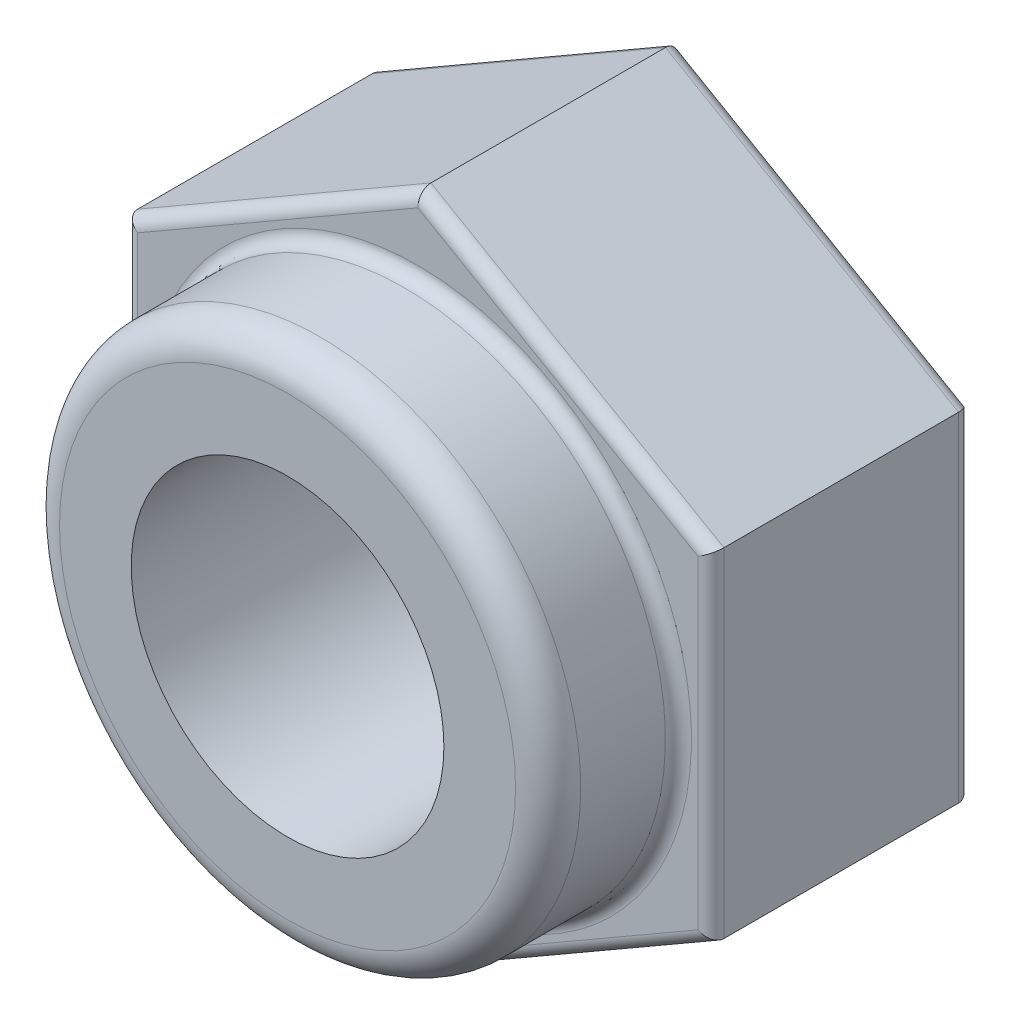
ISO-10303-21;
HEADER;
FILE_DESCRIPTION(('STEP AP214'),'2;1');
FILE_NAME('part.step','',(''),(''),'','','');
FILE_SCHEMA(('AUTOMOTIVE_DESIGN { 1 0 10303 214 1 1 1 1 }'));
ENDSEC;
DATA;
#1=APPLICATION_CONTEXT('core data for automotive mechanical design processes');
#2=APPLICATION_PROTOCOL_DEFINITION('international standard','automotive_design',2000,#1);
#3=PRODUCT_CONTEXT('',#1,'mechanical');
#4=PRODUCT('Part','Part','',(#3));
#5=PRODUCT_RELATED_PRODUCT_CATEGORY('part','',(#4));
#6=PRODUCT_DEFINITION_FORMATION('','',#4);
#7=PRODUCT_DEFINITION_CONTEXT('part definition',#1,'design');
#8=PRODUCT_DEFINITION('design','',#6,#7);
#9=PRODUCT_DEFINITION_SHAPE('','',#8);
#10=(LENGTH_UNIT() NAMED_UNIT(*) SI_UNIT(.MILLI.,.METRE.));
#11=(NAMED_UNIT(*) PLANE_ANGLE_UNIT() SI_UNIT($,.RADIAN.));
#12=(NAMED_UNIT(*) SI_UNIT($,.STERADIAN.) SOLID_ANGLE_UNIT());
#13=UNCERTAINTY_MEASURE_WITH_UNIT(LENGTH_MEASURE(1.E-05),#10,'distance_accuracy_value','');
#14=(GEOMETRIC_REPRESENTATION_CONTEXT(3) GLOBAL_UNCERTAINTY_ASSIGNED_CONTEXT((#13)) GLOBAL_UNIT_ASSIGNED_CONTEXT((#10,
#11,#12)) REPRESENTATION_CONTEXT('',''));
#15=CARTESIAN_POINT('',(0.,0.,0.));
#16=DIRECTION('',(0.,0.,1.));
#17=DIRECTION('',(1.,0.,0.));
#18=AXIS2_PLACEMENT_3D('',#15,#16,#17);
#19=CARTESIAN_POINT('',(-5.715,3.29955678841871,5.08));
#20=DIRECTION('',(0.5,-0.866025403784439,0.));
#21=DIRECTION('',(0.866025403784439,0.5,0.));
#22=AXIS2_PLACEMENT_3D('',#19,#20,#21);
#23=PLANE('',#22);
#24=DIRECTION('',(0.,0.,-1.));
#25=VECTOR('',#24,1.);
#26=CARTESIAN_POINT('',(-5.715,3.29955678841871,5.08));
#27=LINE('',#26,#25);
#28=CARTESIAN_POINT('',(-5.715,3.29955678841871,4.826));
#29=VERTEX_POINT('',#28);
#30=CARTESIAN_POINT('',(-5.715,3.29955678841871,0.254));
#31=VERTEX_POINT('',#30);
#32=EDGE_CURVE('E131',#29,#31,#27,.T.);
#33=ORIENTED_EDGE('',*,*,#32,.F.);
#34=DIRECTION('',(-0.866025403784439,-0.5,0.));
#35=VECTOR('',#34,1.);
#36=CARTESIAN_POINT('',(-5.715,3.29955678841871,4.826));
#37=LINE('',#36,#35);
#38=CARTESIAN_POINT('',(0.,6.59911357683743,4.826));
#39=VERTEX_POINT('',#38);
#40=EDGE_CURVE('E42',#29,#39,#37,.F.);
#41=ORIENTED_EDGE('',*,*,#40,.T.);
#42=DIRECTION('',(0.,0.,-1.));
#43=VECTOR('',#42,1.);
#44=CARTESIAN_POINT('',(0.,6.59911357683743,5.08));
#45=LINE('',#44,#43);
#46=CARTESIAN_POINT('',(0.,6.59911357683743,0.254));
#47=VERTEX_POINT('',#46);
#48=EDGE_CURVE('E259',#39,#47,#45,.T.);
#49=ORIENTED_EDGE('',*,*,#48,.T.);
#50=DIRECTION('',(-0.866025403784439,-0.5,0.));
#51=VECTOR('',#50,1.);
#52=CARTESIAN_POINT('',(-5.715,3.29955678841871,0.254));
#53=LINE('',#52,#51);
#54=EDGE_CURVE('E184',#47,#31,#53,.T.);
#55=ORIENTED_EDGE('',*,*,#54,.T.);
#56=EDGE_LOOP('',(#33,#41,#49,#55));
#57=FACE_BOUND('',#56,.T.);
#58=ADVANCED_FACE('F33',(#57),#23,.F.);
#59=CARTESIAN_POINT('',(-5.715,3.29955678841871,5.08));
#60=DIRECTION('',(1.,0.,0.));
#61=DIRECTION('',(0.,0.,-1.));
#62=AXIS2_PLACEMENT_3D('',#59,#60,#61);
#63=PLANE('',#62);
#64=DIRECTION('',(0.,0.,-1.));
#65=VECTOR('',#64,1.);
#66=CARTESIAN_POINT('',(-5.715,-3.29955678841871,5.08));
#67=LINE('',#66,#65);
#68=CARTESIAN_POINT('',(-5.715,-3.29955678841871,4.826));
#69=VERTEX_POINT('',#68);
#70=CARTESIAN_POINT('',(-5.715,-3.29955678841871,0.254));
#71=VERTEX_POINT('',#70);
#72=EDGE_CURVE('E123',#69,#71,#67,.T.);
#73=ORIENTED_EDGE('',*,*,#72,.F.);
#74=DIRECTION('',(0.,-1.,0.));
#75=VECTOR('',#74,1.);
#76=CARTESIAN_POINT('',(-5.715,3.29955678841871,4.826));
#77=LINE('',#76,#75);
#78=EDGE_CURVE('E50',#69,#29,#77,.F.);
#79=ORIENTED_EDGE('',*,*,#78,.T.);
#80=ORIENTED_EDGE('',*,*,#32,.T.);
#81=DIRECTION('',(0.,-1.,0.));
#82=VECTOR('',#81,1.);
#83=CARTESIAN_POINT('',(-5.715,-3.29955678841871,0.254));
#84=LINE('',#83,#82);
#85=EDGE_CURVE('E140',#31,#71,#84,.T.);
#86=ORIENTED_EDGE('',*,*,#85,.T.);
#87=EDGE_LOOP('',(#73,#79,#80,#86));
#88=FACE_BOUND('',#87,.T.);
#89=ADVANCED_FACE('F153',(#88),#63,.F.);
#90=CARTESIAN_POINT('',(-5.715,-3.29955678841871,5.08));
#91=DIRECTION('',(0.5,0.866025403784439,0.));
#92=DIRECTION('',(-0.866025403784439,0.5,0.));
#93=AXIS2_PLACEMENT_3D('',#90,#91,#92);
#94=PLANE('',#93);
#95=DIRECTION('',(0.,0.,-1.));
#96=VECTOR('',#95,1.);
#97=CARTESIAN_POINT('',(0.,-6.59911357683743,5.08));
#98=LINE('',#97,#96);
#99=CARTESIAN_POINT('',(0.,-6.59911357683743,4.826));
#100=VERTEX_POINT('',#99);
#101=CARTESIAN_POINT('',(0.,-6.59911357683743,0.254));
#102=VERTEX_POINT('',#101);
#103=EDGE_CURVE('E132',#100,#102,#98,.T.);
#104=ORIENTED_EDGE('',*,*,#103,.F.);
#105=DIRECTION('',(0.866025403784439,-0.5,0.));
#106=VECTOR('',#105,1.);
#107=CARTESIAN_POINT('',(-5.715,-3.29955678841871,4.826));
#108=LINE('',#107,#106);
#109=EDGE_CURVE('E58',#100,#69,#108,.F.);
#110=ORIENTED_EDGE('',*,*,#109,.T.);
#111=ORIENTED_EDGE('',*,*,#72,.T.);
#112=DIRECTION('',(0.866025403784439,-0.5,0.));
#113=VECTOR('',#112,1.);
#114=CARTESIAN_POINT('',(0.,-6.59911357683743,0.254));
#115=LINE('',#114,#113);
#116=EDGE_CURVE('E127',#71,#102,#115,.T.);
#117=ORIENTED_EDGE('',*,*,#116,.T.);
#118=EDGE_LOOP('',(#104,#110,#111,#117));
#119=FACE_BOUND('',#118,.T.);
#120=ADVANCED_FACE('F125',(#119),#94,.F.);
#121=CARTESIAN_POINT('',(0.,-6.59911357683743,5.08));
#122=DIRECTION('',(-0.500000000000001,0.866025403784438,0.));
#123=DIRECTION('',(-0.866025403784438,-0.500000000000001,0.));
#124=AXIS2_PLACEMENT_3D('',#121,#122,#123);
#125=PLANE('',#124);
#126=DIRECTION('',(0.,0.,-1.));
#127=VECTOR('',#126,1.);
#128=CARTESIAN_POINT('',(5.715,-3.29955678841871,5.08));
#129=LINE('',#128,#127);
#130=CARTESIAN_POINT('',(5.715,-3.29955678841871,4.826));
#131=VERTEX_POINT('',#130);
#132=CARTESIAN_POINT('',(5.715,-3.29955678841871,0.254));
#133=VERTEX_POINT('',#132);
#134=EDGE_CURVE('E279',#131,#133,#129,.T.);
#135=ORIENTED_EDGE('',*,*,#134,.F.);
#136=DIRECTION('',(0.866025403784438,0.500000000000001,0.));
#137=VECTOR('',#136,1.);
#138=CARTESIAN_POINT('',(0.,-6.59911357683743,4.826));
#139=LINE('',#138,#137);
#140=EDGE_CURVE('E222',#131,#100,#139,.F.);
#141=ORIENTED_EDGE('',*,*,#140,.T.);
#142=ORIENTED_EDGE('',*,*,#103,.T.);
#143=DIRECTION('',(0.866025403784438,0.500000000000001,0.));
#144=VECTOR('',#143,1.);
#145=CARTESIAN_POINT('',(5.715,-3.29955678841871,0.254));
#146=LINE('',#145,#144);
#147=EDGE_CURVE('E151',#102,#133,#146,.T.);
#148=ORIENTED_EDGE('',*,*,#147,.T.);
#149=EDGE_LOOP('',(#135,#141,#142,#148));
#150=FACE_BOUND('',#149,.T.);
#151=ADVANCED_FACE('F281',(#150),#125,.F.);
#152=CARTESIAN_POINT('',(5.715,3.29955678841871,5.08));
#153=DIRECTION('',(-1.,0.,0.));
#154=DIRECTION('',(0.,-1.,0.));
#155=AXIS2_PLACEMENT_3D('',#152,#153,#154);
#156=PLANE('',#155);
#157=DIRECTION('',(0.,0.,-1.));
#158=VECTOR('',#157,1.);
#159=CARTESIAN_POINT('',(5.715,3.29955678841871,5.08));
#160=LINE('',#159,#158);
#161=CARTESIAN_POINT('',(5.715,3.29955678841871,4.826));
#162=VERTEX_POINT('',#161);
#163=CARTESIAN_POINT('',(5.715,3.29955678841871,0.254));
#164=VERTEX_POINT('',#163);
#165=EDGE_CURVE('E266',#162,#164,#160,.T.);
#166=ORIENTED_EDGE('',*,*,#165,.F.);
#167=DIRECTION('',(0.,1.,0.));
#168=VECTOR('',#167,1.);
#169=CARTESIAN_POINT('',(5.715,3.29955678841871,4.826));
#170=LINE('',#169,#168);
#171=EDGE_CURVE('E220',#162,#131,#170,.F.);
#172=ORIENTED_EDGE('',*,*,#171,.T.);
#173=ORIENTED_EDGE('',*,*,#134,.T.);
#174=DIRECTION('',(0.,1.,0.));
#175=VECTOR('',#174,1.);
#176=CARTESIAN_POINT('',(5.715,3.29955678841871,0.254));
#177=LINE('',#176,#175);
#178=EDGE_CURVE('E178',#133,#164,#177,.T.);
#179=ORIENTED_EDGE('',*,*,#178,.T.);
#180=EDGE_LOOP('',(#166,#172,#173,#179));
#181=FACE_BOUND('',#180,.T.);
#182=ADVANCED_FACE('F278',(#181),#156,.F.);
#183=CARTESIAN_POINT('',(0.,6.59911357683743,5.08));
#184=DIRECTION('',(-0.500000000000001,-0.866025403784438,0.));
#185=DIRECTION('',(0.866025403784438,-0.500000000000001,0.));
#186=AXIS2_PLACEMENT_3D('',#183,#184,#185);
#187=PLANE('',#186);
#188=ORIENTED_EDGE('',*,*,#48,.F.);
#189=DIRECTION('',(-0.866025403784438,0.500000000000001,0.));
#190=VECTOR('',#189,1.);
#191=CARTESIAN_POINT('',(0.,6.59911357683743,4.826));
#192=LINE('',#191,#190);
#193=EDGE_CURVE('E217',#39,#162,#192,.F.);
#194=ORIENTED_EDGE('',*,*,#193,.T.);
#195=ORIENTED_EDGE('',*,*,#165,.T.);
#196=DIRECTION('',(-0.866025403784438,0.500000000000001,0.));
#197=VECTOR('',#196,1.);
#198=CARTESIAN_POINT('',(0.,6.59911357683743,0.254));
#199=LINE('',#198,#197);
#200=EDGE_CURVE('E181',#164,#47,#199,.T.);
#201=ORIENTED_EDGE('',*,*,#200,.T.);
#202=EDGE_LOOP('',(#188,#194,#195,#201));
#203=FACE_BOUND('',#202,.T.);
#204=ADVANCED_FACE('F262',(#203),#187,.F.);
#205=CARTESIAN_POINT('',(0.,0.,5.08));
#206=DIRECTION('',(0.,0.,-1.));
#207=DIRECTION('',(-1.,0.,0.));
#208=AXIS2_PLACEMENT_3D('',#205,#206,#207);
#209=PLANE('',#208);
#210=DIRECTION('',(0.,1.,0.));
#211=VECTOR('',#210,1.);
#212=CARTESIAN_POINT('',(5.461,0.,5.08));
#213=LINE('',#212,#211);
#214=CARTESIAN_POINT('',(5.461,-3.15290982004455,5.08));
#215=VERTEX_POINT('',#214);
#216=CARTESIAN_POINT('',(5.461,3.15290982004455,5.08));
#217=VERTEX_POINT('',#216);
#218=EDGE_CURVE('E212',#215,#217,#213,.T.);
#219=ORIENTED_EDGE('',*,*,#218,.T.);
#220=DIRECTION('',(-0.866025403784438,0.500000000000001,0.));
#221=VECTOR('',#220,1.);
#222=CARTESIAN_POINT('',(2.73050000000001,4.72936473006682,5.08));
#223=LINE('',#222,#221);
#224=CARTESIAN_POINT('',(0.,6.3058196400891,5.08));
#225=VERTEX_POINT('',#224);
#226=EDGE_CURVE('E214',#217,#225,#223,.T.);
#227=ORIENTED_EDGE('',*,*,#226,.T.);
#228=DIRECTION('',(-0.866025403784439,-0.5,0.));
#229=VECTOR('',#228,1.);
#230=CARTESIAN_POINT('',(-2.7305,4.72936473006682,5.08));
#231=LINE('',#230,#229);
#232=CARTESIAN_POINT('',(-5.461,3.15290982004455,5.08));
#233=VERTEX_POINT('',#232);
#234=EDGE_CURVE('E204',#225,#233,#231,.T.);
#235=ORIENTED_EDGE('',*,*,#234,.T.);
#236=DIRECTION('',(0.,-1.,0.));
#237=VECTOR('',#236,1.);
#238=CARTESIAN_POINT('',(-5.461,0.,5.08));
#239=LINE('',#238,#237);
#240=CARTESIAN_POINT('',(-5.461,-3.15290982004455,5.08));
#241=VERTEX_POINT('',#240);
#242=EDGE_CURVE('E206',#233,#241,#239,.T.);
#243=ORIENTED_EDGE('',*,*,#242,.T.);
#244=DIRECTION('',(0.866025403784439,-0.5,0.));
#245=VECTOR('',#244,1.);
#246=CARTESIAN_POINT('',(-2.7305,-4.72936473006682,5.08));
#247=LINE('',#246,#245);
#248=CARTESIAN_POINT('',(0.,-6.3058196400891,5.08));
#249=VERTEX_POINT('',#248);
#250=EDGE_CURVE('E208',#241,#249,#247,.T.);
#251=ORIENTED_EDGE('',*,*,#250,.T.);
#252=DIRECTION('',(0.866025403784438,0.500000000000001,0.));
#253=VECTOR('',#252,1.);
#254=CARTESIAN_POINT('',(2.7305,-4.72936473006682,5.08));
#255=LINE('',#254,#253);
#256=EDGE_CURVE('E210',#249,#215,#255,.T.);
#257=ORIENTED_EDGE('',*,*,#256,.T.);
#258=EDGE_LOOP('',(#219,#227,#235,#243,#251,#257));
#259=FACE_BOUND('',#258,.T.);
#260=CARTESIAN_POINT('',(0.,0.,5.08));
#261=DIRECTION('',(0.,0.,-1.));
#262=DIRECTION('',(-1.,0.,0.));
#263=AXIS2_PLACEMENT_3D('',#260,#261,#262);
#264=CIRCLE('',#263,5.334);
#265=CARTESIAN_POINT('',(-5.334,0.,5.08));
#266=VERTEX_POINT('',#265);
#267=EDGE_CURVE('E188',#266,#266,#264,.T.);
#268=ORIENTED_EDGE('',*,*,#267,.T.);
#269=EDGE_LOOP('',(#268));
#270=FACE_BOUND('',#269,.T.);
#271=ADVANCED_FACE('F324',(#259,#270),#209,.F.);
#272=CARTESIAN_POINT('',(0.,0.,0.));
#273=DIRECTION('',(0.,0.,-1.));
#274=DIRECTION('',(-1.,0.,0.));
#275=AXIS2_PLACEMENT_3D('',#272,#273,#274);
#276=PLANE('',#275);
#277=DIRECTION('',(0.866025403784439,-0.5,0.));
#278=VECTOR('',#277,1.);
#279=CARTESIAN_POINT('',(-5.588,-3.07958633585747,0.));
#280=LINE('',#279,#278);
#281=CARTESIAN_POINT('',(0.,-6.3058196400891,0.));
#282=VERTEX_POINT('',#281);
#283=CARTESIAN_POINT('',(-5.461,-3.15290982004455,0.));
#284=VERTEX_POINT('',#283);
#285=EDGE_CURVE('E173',#282,#284,#280,.F.);
#286=ORIENTED_EDGE('',*,*,#285,.T.);
#287=DIRECTION('',(0.,-1.,0.));
#288=VECTOR('',#287,1.);
#289=CARTESIAN_POINT('',(-5.461,3.29955678841871,0.));
#290=LINE('',#289,#288);
#291=CARTESIAN_POINT('',(-5.461,3.15290982004455,0.));
#292=VERTEX_POINT('',#291);
#293=EDGE_CURVE('E142',#284,#292,#290,.F.);
#294=ORIENTED_EDGE('',*,*,#293,.T.);
#295=DIRECTION('',(-0.866025403784439,-0.5,0.));
#296=VECTOR('',#295,1.);
#297=CARTESIAN_POINT('',(0.127000000000003,6.37914312427618,0.));
#298=LINE('',#297,#296);
#299=CARTESIAN_POINT('',(0.,6.3058196400891,0.));
#300=VERTEX_POINT('',#299);
#301=EDGE_CURVE('E159',#292,#300,#298,.F.);
#302=ORIENTED_EDGE('',*,*,#301,.T.);
#303=DIRECTION('',(-0.866025403784438,0.500000000000001,0.));
#304=VECTOR('',#303,1.);
#305=CARTESIAN_POINT('',(5.588,3.07958633585746,0.));
#306=LINE('',#305,#304);
#307=CARTESIAN_POINT('',(5.461,3.15290982004455,0.));
#308=VERTEX_POINT('',#307);
#309=EDGE_CURVE('E167',#300,#308,#306,.F.);
#310=ORIENTED_EDGE('',*,*,#309,.T.);
#311=DIRECTION('',(0.,1.,0.));
#312=VECTOR('',#311,1.);
#313=CARTESIAN_POINT('',(5.461,-3.29955678841871,0.));
#314=LINE('',#313,#312);
#315=CARTESIAN_POINT('',(5.461,-3.15290982004455,0.));
#316=VERTEX_POINT('',#315);
#317=EDGE_CURVE('E169',#308,#316,#314,.F.);
#318=ORIENTED_EDGE('',*,*,#317,.T.);
#319=DIRECTION('',(0.866025403784438,0.500000000000001,0.));
#320=VECTOR('',#319,1.);
#321=CARTESIAN_POINT('',(-0.126999999999997,-6.37914312427618,0.));
#322=LINE('',#321,#320);
#323=EDGE_CURVE('E171',#316,#282,#322,.F.);
#324=ORIENTED_EDGE('',*,*,#323,.T.);
#325=EDGE_LOOP('',(#286,#294,#302,#310,#318,#324));
#326=FACE_BOUND('',#325,.T.);
#327=CARTESIAN_POINT('',(0.,0.,0.));
#328=DIRECTION('',(0.,0.,-1.));
#329=DIRECTION('',(-1.,0.,0.));
#330=AXIS2_PLACEMENT_3D('',#327,#328,#329);
#331=CIRCLE('',#330,3.302);
#332=CARTESIAN_POINT('',(-3.302,0.,0.));
#333=VERTEX_POINT('',#332);
#334=EDGE_CURVE('E155',#333,#333,#331,.F.);
#335=ORIENTED_EDGE('',*,*,#334,.T.);
#336=EDGE_LOOP('',(#335));
#337=FACE_BOUND('',#336,.T.);
#338=ADVANCED_FACE('F325',(#326,#337),#276,.T.);
#339=CARTESIAN_POINT('',(0.,0.,7.62));
#340=DIRECTION('',(0.,0.,-1.));
#341=DIRECTION('',(-1.,0.,0.));
#342=AXIS2_PLACEMENT_3D('',#339,#340,#341);
#343=CYLINDRICAL_SURFACE('',#342,5.08);
#344=CARTESIAN_POINT('',(0.,0.,5.334));
#345=DIRECTION('',(0.,0.,-1.));
#346=DIRECTION('',(-1.,0.,0.));
#347=AXIS2_PLACEMENT_3D('',#344,#345,#346);
#348=CIRCLE('',#347,5.08);
#349=CARTESIAN_POINT('',(-5.08,0.,5.334));
#350=VERTEX_POINT('',#349);
#351=EDGE_CURVE('E11',#350,#350,#348,.F.);
#352=ORIENTED_EDGE('',*,*,#351,.T.);
#353=EDGE_LOOP('',(#352));
#354=FACE_BOUND('',#353,.T.);
#355=CARTESIAN_POINT('',(0.,0.,6.985));
#356=DIRECTION('',(0.,0.,1.));
#357=DIRECTION('',(1.,0.,0.));
#358=AXIS2_PLACEMENT_3D('',#355,#356,#357);
#359=CIRCLE('',#358,5.08);
#360=CARTESIAN_POINT('',(5.08,0.,6.985));
#361=VERTEX_POINT('',#360);
#362=EDGE_CURVE('E156',#361,#361,#359,.F.);
#363=ORIENTED_EDGE('',*,*,#362,.T.);
#364=EDGE_LOOP('',(#363));
#365=FACE_BOUND('',#364,.T.);
#366=ADVANCED_FACE('F304',(#354,#365),#343,.T.);
#367=CARTESIAN_POINT('',(0.,0.,7.62));
#368=DIRECTION('',(0.,0.,1.));
#369=DIRECTION('',(1.,0.,0.));
#370=AXIS2_PLACEMENT_3D('',#367,#368,#369);
#371=PLANE('',#370);
#372=CARTESIAN_POINT('',(0.,0.,7.62));
#373=DIRECTION('',(0.,0.,1.));
#374=DIRECTION('',(1.,0.,0.));
#375=AXIS2_PLACEMENT_3D('',#372,#373,#374);
#376=CIRCLE('',#375,3.048);
#377=CARTESIAN_POINT('',(3.048,0.,7.62));
#378=VERTEX_POINT('',#377);
#379=EDGE_CURVE('E201',#378,#378,#376,.T.);
#380=ORIENTED_EDGE('',*,*,#379,.F.);
#381=EDGE_LOOP('',(#380));
#382=FACE_BOUND('',#381,.T.);
#383=CARTESIAN_POINT('',(0.,0.,7.62));
#384=DIRECTION('',(0.,0.,1.));
#385=DIRECTION('',(1.,0.,0.));
#386=AXIS2_PLACEMENT_3D('',#383,#384,#385);
#387=CIRCLE('',#386,4.445);
#388=CARTESIAN_POINT('',(4.445,0.,7.62));
#389=VERTEX_POINT('',#388);
#390=EDGE_CURVE('E162',#389,#389,#387,.T.);
#391=ORIENTED_EDGE('',*,*,#390,.T.);
#392=EDGE_LOOP('',(#391));
#393=FACE_BOUND('',#392,.T.);
#394=ADVANCED_FACE('F290',(#382,#393),#371,.T.);
#395=CARTESIAN_POINT('',(0.,0.,6.985));
#396=DIRECTION('',(0.,0.,1.));
#397=DIRECTION('',(1.,0.,0.));
#398=AXIS2_PLACEMENT_3D('',#395,#396,#397);
#399=TOROIDAL_SURFACE('',#398,4.445,0.635);
#400=ORIENTED_EDGE('',*,*,#362,.F.);
#401=EDGE_LOOP('',(#400));
#402=FACE_BOUND('',#401,.T.);
#403=ORIENTED_EDGE('',*,*,#390,.F.);
#404=EDGE_LOOP('',(#403));
#405=FACE_BOUND('',#404,.T.);
#406=ADVANCED_FACE('F292',(#402,#405),#399,.T.);
#407=CARTESIAN_POINT('',(0.,0.,0.));
#408=DIRECTION('',(0.,0.,1.));
#409=DIRECTION('',(1.,0.,0.));
#410=AXIS2_PLACEMENT_3D('',#407,#408,#409);
#411=CYLINDRICAL_SURFACE('',#410,3.048);
#412=CARTESIAN_POINT('',(0.,0.,0.254));
#413=DIRECTION('',(0.,0.,-1.));
#414=DIRECTION('',(-1.,0.,0.));
#415=AXIS2_PLACEMENT_3D('',#412,#413,#414);
#416=CIRCLE('',#415,3.048);
#417=CARTESIAN_POINT('',(-3.048,0.,0.254));
#418=VERTEX_POINT('',#417);
#419=EDGE_CURVE('E186',#418,#418,#416,.T.);
#420=ORIENTED_EDGE('',*,*,#419,.T.);
#421=EDGE_LOOP('',(#420));
#422=FACE_BOUND('',#421,.T.);
#423=ORIENTED_EDGE('',*,*,#379,.T.);
#424=EDGE_LOOP('',(#423));
#425=FACE_BOUND('',#424,.T.);
#426=ADVANCED_FACE('F294',(#422,#425),#411,.F.);
#427=CARTESIAN_POINT('',(5.461,3.29955678841871,0.254));
#428=DIRECTION('',(0.,-1.,0.));
#429=DIRECTION('',(1.,0.,0.));
#430=AXIS2_PLACEMENT_3D('',#427,#428,#429);
#431=CYLINDRICAL_SURFACE('',#430,0.254);
#432=CARTESIAN_POINT('',(5.461,-3.15290982004454,0.254));
#433=DIRECTION('',(-0.5,-0.866025403784439,0.));
#434=DIRECTION('',(0.866025403784439,-0.5,0.));
#435=AXIS2_PLACEMENT_3D('',#432,#433,#434);
#436=ELLIPSE('',#435,0.29329393674833,0.254);
#437=EDGE_CURVE('E195',#316,#133,#436,.T.);
#438=ORIENTED_EDGE('',*,*,#437,.F.);
#439=ORIENTED_EDGE('',*,*,#317,.F.);
#440=CARTESIAN_POINT('',(5.461,3.15290982004455,0.254));
#441=DIRECTION('',(0.5,-0.866025403784439,0.));
#442=DIRECTION('',(0.866025403784439,0.5,0.));
#443=AXIS2_PLACEMENT_3D('',#440,#441,#442);
#444=ELLIPSE('',#443,0.29329393674833,0.254);
#445=EDGE_CURVE('E198',#164,#308,#444,.F.);
#446=ORIENTED_EDGE('',*,*,#445,.F.);
#447=ORIENTED_EDGE('',*,*,#178,.F.);
#448=EDGE_LOOP('',(#438,#439,#446,#447));
#449=FACE_BOUND('',#448,.T.);
#450=ADVANCED_FACE('F301',(#449),#431,.T.);
#451=CARTESIAN_POINT('',(-0.126999999999997,6.37914312427618,0.254));
#452=DIRECTION('',(0.866025403784438,-0.500000000000001,0.));
#453=DIRECTION('',(0.500000000000001,0.866025403784438,0.));
#454=AXIS2_PLACEMENT_3D('',#451,#452,#453);
#455=CYLINDRICAL_SURFACE('',#454,0.254);
#456=ORIENTED_EDGE('',*,*,#445,.T.);
#457=ORIENTED_EDGE('',*,*,#309,.F.);
#458=CARTESIAN_POINT('',(0.,6.3058196400891,0.254));
#459=DIRECTION('',(1.,0.,0.));
#460=DIRECTION('',(0.,1.,0.));
#461=AXIS2_PLACEMENT_3D('',#458,#459,#460);
#462=ELLIPSE('',#461,0.29329393674833,0.254);
#463=EDGE_CURVE('E192',#47,#300,#462,.F.);
#464=ORIENTED_EDGE('',*,*,#463,.F.);
#465=ORIENTED_EDGE('',*,*,#200,.F.);
#466=EDGE_LOOP('',(#456,#457,#464,#465));
#467=FACE_BOUND('',#466,.T.);
#468=ADVANCED_FACE('F388',(#467),#455,.T.);
#469=CARTESIAN_POINT('',(-0.126999999999997,-6.37914312427618,0.254));
#470=DIRECTION('',(-0.866025403784438,-0.500000000000001,0.));
#471=DIRECTION('',(0.500000000000001,-0.866025403784438,0.));
#472=AXIS2_PLACEMENT_3D('',#469,#470,#471);
#473=CYLINDRICAL_SURFACE('',#472,0.254);
#474=ORIENTED_EDGE('',*,*,#437,.T.);
#475=ORIENTED_EDGE('',*,*,#147,.F.);
#476=CARTESIAN_POINT('',(0.,-6.3058196400891,0.254));
#477=DIRECTION('',(-1.,0.,0.));
#478=DIRECTION('',(0.,-1.,0.));
#479=AXIS2_PLACEMENT_3D('',#476,#477,#478);
#480=ELLIPSE('',#479,0.29329393674833,0.254);
#481=EDGE_CURVE('E150',#282,#102,#480,.T.);
#482=ORIENTED_EDGE('',*,*,#481,.F.);
#483=ORIENTED_EDGE('',*,*,#323,.F.);
#484=EDGE_LOOP('',(#474,#475,#482,#483));
#485=FACE_BOUND('',#484,.T.);
#486=ADVANCED_FACE('F384',(#485),#473,.T.);
#487=CARTESIAN_POINT('',(-5.588,3.07958633585747,0.254));
#488=DIRECTION('',(0.866025403784439,0.5,0.));
#489=DIRECTION('',(-0.5,0.866025403784439,0.));
#490=AXIS2_PLACEMENT_3D('',#487,#488,#489);
#491=CYLINDRICAL_SURFACE('',#490,0.254);
#492=ORIENTED_EDGE('',*,*,#463,.T.);
#493=ORIENTED_EDGE('',*,*,#301,.F.);
#494=CARTESIAN_POINT('',(-5.461,3.15290982004455,0.254));
#495=DIRECTION('',(0.5,0.866025403784439,0.));
#496=DIRECTION('',(0.866025403784439,-0.5,0.));
#497=AXIS2_PLACEMENT_3D('',#494,#495,#496);
#498=ELLIPSE('',#497,0.29329393674833,0.254);
#499=EDGE_CURVE('E145',#31,#292,#498,.F.);
#500=ORIENTED_EDGE('',*,*,#499,.F.);
#501=ORIENTED_EDGE('',*,*,#54,.F.);
#502=EDGE_LOOP('',(#492,#493,#500,#501));
#503=FACE_BOUND('',#502,.T.);
#504=ADVANCED_FACE('F379',(#503),#491,.T.);
#505=CARTESIAN_POINT('',(-5.588,-3.07958633585747,0.254));
#506=DIRECTION('',(-0.866025403784439,0.5,0.));
#507=DIRECTION('',(-0.5,-0.866025403784439,0.));
#508=AXIS2_PLACEMENT_3D('',#505,#506,#507);
#509=CYLINDRICAL_SURFACE('',#508,0.254);
#510=ORIENTED_EDGE('',*,*,#481,.T.);
#511=ORIENTED_EDGE('',*,*,#116,.F.);
#512=CARTESIAN_POINT('',(-5.461,-3.15290982004455,0.254));
#513=DIRECTION('',(-0.5,0.866025403784439,0.));
#514=DIRECTION('',(-0.866025403784439,-0.5,0.));
#515=AXIS2_PLACEMENT_3D('',#512,#513,#514);
#516=ELLIPSE('',#515,0.29329393674833,0.254);
#517=EDGE_CURVE('E138',#284,#71,#516,.T.);
#518=ORIENTED_EDGE('',*,*,#517,.F.);
#519=ORIENTED_EDGE('',*,*,#285,.F.);
#520=EDGE_LOOP('',(#510,#511,#518,#519));
#521=FACE_BOUND('',#520,.T.);
#522=ADVANCED_FACE('F148',(#521),#509,.T.);
#523=CARTESIAN_POINT('',(-5.461,3.29955678841871,0.254));
#524=DIRECTION('',(0.,1.,0.));
#525=DIRECTION('',(0.,0.,1.));
#526=AXIS2_PLACEMENT_3D('',#523,#524,#525);
#527=CYLINDRICAL_SURFACE('',#526,0.254);
#528=ORIENTED_EDGE('',*,*,#499,.T.);
#529=ORIENTED_EDGE('',*,*,#293,.F.);
#530=ORIENTED_EDGE('',*,*,#517,.T.);
#531=ORIENTED_EDGE('',*,*,#85,.F.);
#532=EDGE_LOOP('',(#528,#529,#530,#531));
#533=FACE_BOUND('',#532,.T.);
#534=ADVANCED_FACE('F139',(#533),#527,.T.);
#535=CARTESIAN_POINT('',(0.,0.,0.254));
#536=DIRECTION('',(0.,0.,-1.));
#537=DIRECTION('',(-1.,0.,0.));
#538=AXIS2_PLACEMENT_3D('',#535,#536,#537);
#539=TOROIDAL_SURFACE('',#538,3.302,0.254);
#540=ORIENTED_EDGE('',*,*,#419,.F.);
#541=EDGE_LOOP('',(#540));
#542=FACE_BOUND('',#541,.T.);
#543=ORIENTED_EDGE('',*,*,#334,.F.);
#544=EDGE_LOOP('',(#543));
#545=FACE_BOUND('',#544,.T.);
#546=ADVANCED_FACE('F352',(#542,#545),#539,.T.);
#547=CARTESIAN_POINT('',(-2.7305,-4.72936473006682,4.826));
#548=DIRECTION('',(0.866025403784439,-0.5,0.));
#549=DIRECTION('',(0.5,0.866025403784439,0.));
#550=AXIS2_PLACEMENT_3D('',#547,#548,#549);
#551=CYLINDRICAL_SURFACE('',#550,0.254);
#552=CARTESIAN_POINT('',(-5.461,-3.15290982004455,4.826));
#553=DIRECTION('',(0.5,-0.866025403784439,0.));
#554=DIRECTION('',(-0.866025403784439,-0.5,0.));
#555=AXIS2_PLACEMENT_3D('',#552,#553,#554);
#556=ELLIPSE('',#555,0.29329393674833,0.254);
#557=EDGE_CURVE('E236',#69,#241,#556,.F.);
#558=ORIENTED_EDGE('',*,*,#557,.F.);
#559=ORIENTED_EDGE('',*,*,#109,.F.);
#560=CARTESIAN_POINT('',(0.,-6.3058196400891,4.826));
#561=DIRECTION('',(1.,0.,0.));
#562=DIRECTION('',(0.,-1.,0.));
#563=AXIS2_PLACEMENT_3D('',#560,#561,#562);
#564=ELLIPSE('',#563,0.29329393674833,0.254);
#565=EDGE_CURVE('E37',#249,#100,#564,.T.);
#566=ORIENTED_EDGE('',*,*,#565,.F.);
#567=ORIENTED_EDGE('',*,*,#250,.F.);
#568=EDGE_LOOP('',(#558,#559,#566,#567));
#569=FACE_BOUND('',#568,.T.);
#570=ADVANCED_FACE('F249',(#569),#551,.T.);
#571=CARTESIAN_POINT('',(2.7305,-4.72936473006682,4.826));
#572=DIRECTION('',(0.866025403784438,0.500000000000001,0.));
#573=DIRECTION('',(-0.500000000000001,0.866025403784438,0.));
#574=AXIS2_PLACEMENT_3D('',#571,#572,#573);
#575=CYLINDRICAL_SURFACE('',#574,0.254);
#576=ORIENTED_EDGE('',*,*,#565,.T.);
#577=ORIENTED_EDGE('',*,*,#140,.F.);
#578=CARTESIAN_POINT('',(5.461,-3.15290982004455,4.826));
#579=DIRECTION('',(0.5,0.866025403784439,0.));
#580=DIRECTION('',(0.866025403784439,-0.5,0.));
#581=AXIS2_PLACEMENT_3D('',#578,#579,#580);
#582=ELLIPSE('',#581,0.29329393674833,0.254);
#583=EDGE_CURVE('E234',#215,#131,#582,.T.);
#584=ORIENTED_EDGE('',*,*,#583,.F.);
#585=ORIENTED_EDGE('',*,*,#256,.F.);
#586=EDGE_LOOP('',(#576,#577,#584,#585));
#587=FACE_BOUND('',#586,.T.);
#588=ADVANCED_FACE('F245',(#587),#575,.T.);
#589=CARTESIAN_POINT('',(-5.461,0.,4.826));
#590=DIRECTION('',(0.,-1.,0.));
#591=DIRECTION('',(0.,0.,-1.));
#592=AXIS2_PLACEMENT_3D('',#589,#590,#591);
#593=CYLINDRICAL_SURFACE('',#592,0.254);
#594=ORIENTED_EDGE('',*,*,#557,.T.);
#595=ORIENTED_EDGE('',*,*,#242,.F.);
#596=CARTESIAN_POINT('',(-5.461,3.15290982004455,4.826));
#597=DIRECTION('',(-0.5,-0.866025403784439,0.));
#598=DIRECTION('',(-0.866025403784439,0.5,0.));
#599=AXIS2_PLACEMENT_3D('',#596,#597,#598);
#600=ELLIPSE('',#599,0.29329393674833,0.254);
#601=EDGE_CURVE('E231',#29,#233,#600,.F.);
#602=ORIENTED_EDGE('',*,*,#601,.F.);
#603=ORIENTED_EDGE('',*,*,#78,.F.);
#604=EDGE_LOOP('',(#594,#595,#602,#603));
#605=FACE_BOUND('',#604,.T.);
#606=ADVANCED_FACE('F251',(#605),#593,.T.);
#607=CARTESIAN_POINT('',(5.461,0.,4.826));
#608=DIRECTION('',(0.,1.,0.));
#609=DIRECTION('',(-1.,0.,0.));
#610=AXIS2_PLACEMENT_3D('',#607,#608,#609);
#611=CYLINDRICAL_SURFACE('',#610,0.254);
#612=ORIENTED_EDGE('',*,*,#583,.T.);
#613=ORIENTED_EDGE('',*,*,#171,.F.);
#614=CARTESIAN_POINT('',(5.461,3.15290982004455,4.826));
#615=DIRECTION('',(-0.5,0.866025403784439,0.));
#616=DIRECTION('',(0.866025403784439,0.5,0.));
#617=AXIS2_PLACEMENT_3D('',#614,#615,#616);
#618=ELLIPSE('',#617,0.29329393674833,0.254);
#619=EDGE_CURVE('E229',#217,#162,#618,.T.);
#620=ORIENTED_EDGE('',*,*,#619,.F.);
#621=ORIENTED_EDGE('',*,*,#218,.F.);
#622=EDGE_LOOP('',(#612,#613,#620,#621));
#623=FACE_BOUND('',#622,.T.);
#624=ADVANCED_FACE('F275',(#623),#611,.T.);
#625=CARTESIAN_POINT('',(-2.7305,4.72936473006682,4.826));
#626=DIRECTION('',(-0.866025403784439,-0.5,0.));
#627=DIRECTION('',(0.5,-0.866025403784439,0.));
#628=AXIS2_PLACEMENT_3D('',#625,#626,#627);
#629=CYLINDRICAL_SURFACE('',#628,0.254);
#630=ORIENTED_EDGE('',*,*,#601,.T.);
#631=ORIENTED_EDGE('',*,*,#234,.F.);
#632=CARTESIAN_POINT('',(0.,6.3058196400891,4.826));
#633=DIRECTION('',(-1.,0.,0.));
#634=DIRECTION('',(0.,-1.,0.));
#635=AXIS2_PLACEMENT_3D('',#632,#633,#634);
#636=ELLIPSE('',#635,0.29329393674833,0.254);
#637=EDGE_CURVE('E227',#39,#225,#636,.F.);
#638=ORIENTED_EDGE('',*,*,#637,.F.);
#639=ORIENTED_EDGE('',*,*,#40,.F.);
#640=EDGE_LOOP('',(#630,#631,#638,#639));
#641=FACE_BOUND('',#640,.T.);
#642=ADVANCED_FACE('F256',(#641),#629,.T.);
#643=CARTESIAN_POINT('',(2.73050000000001,4.72936473006682,4.826));
#644=DIRECTION('',(-0.866025403784438,0.500000000000001,0.));
#645=DIRECTION('',(-0.500000000000001,-0.866025403784438,0.));
#646=AXIS2_PLACEMENT_3D('',#643,#644,#645);
#647=CYLINDRICAL_SURFACE('',#646,0.254);
#648=ORIENTED_EDGE('',*,*,#619,.T.);
#649=ORIENTED_EDGE('',*,*,#193,.F.);
#650=ORIENTED_EDGE('',*,*,#637,.T.);
#651=ORIENTED_EDGE('',*,*,#226,.F.);
#652=EDGE_LOOP('',(#648,#649,#650,#651));
#653=FACE_BOUND('',#652,.T.);
#654=ADVANCED_FACE('F269',(#653),#647,.T.);
#655=CARTESIAN_POINT('',(0.,0.,5.334));
#656=DIRECTION('',(0.,0.,-1.));
#657=DIRECTION('',(-1.,0.,0.));
#658=AXIS2_PLACEMENT_3D('',#655,#656,#657);
#659=TOROIDAL_SURFACE('',#658,5.334,0.254);
#660=ORIENTED_EDGE('',*,*,#267,.F.);
#661=EDGE_LOOP('',(#660));
#662=FACE_BOUND('',#661,.T.);
#663=ORIENTED_EDGE('',*,*,#351,.F.);
#664=EDGE_LOOP('',(#663));
#665=FACE_BOUND('',#664,.T.);
#666=ADVANCED_FACE('F35',(#662,#665),#659,.F.);
#667=CLOSED_SHELL('',(#58,#89,#120,#151,#182,#204,#271,#338,#366,#394,#406,#426,#450,#468,#486,
#504,#522,#534,#546,#570,#588,#606,#624,#642,#654,#666));
#668=MANIFOLD_SOLID_BREP('B2',#667);
#669=ADVANCED_BREP_SHAPE_REPRESENTATION('',(#18,#668),#14);
#670=SHAPE_DEFINITION_REPRESENTATION(#9,#669);
ENDSEC;
END-ISO-10303-21;
